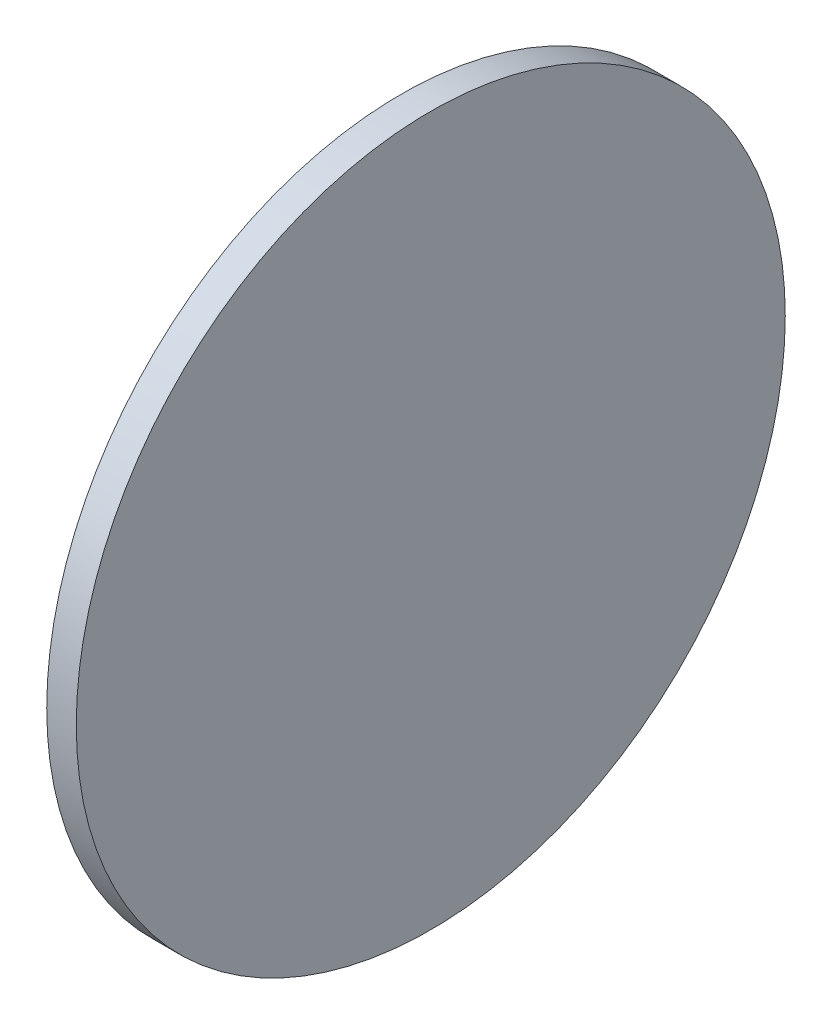
ISO-10303-21;
HEADER;
FILE_DESCRIPTION(('STEP AP214'),'2;1');
FILE_NAME('part.step','',(''),(''),'','','');
FILE_SCHEMA(('AUTOMOTIVE_DESIGN { 1 0 10303 214 1 1 1 1 }'));
ENDSEC;
DATA;
#1=APPLICATION_CONTEXT('core data for automotive mechanical design processes');
#2=APPLICATION_PROTOCOL_DEFINITION('international standard','automotive_design',2000,#1);
#3=PRODUCT_CONTEXT('',#1,'mechanical');
#4=PRODUCT('Part','Part','',(#3));
#5=PRODUCT_RELATED_PRODUCT_CATEGORY('part','',(#4));
#6=PRODUCT_DEFINITION_FORMATION('','',#4);
#7=PRODUCT_DEFINITION_CONTEXT('part definition',#1,'design');
#8=PRODUCT_DEFINITION('design','',#6,#7);
#9=PRODUCT_DEFINITION_SHAPE('','',#8);
#10=(LENGTH_UNIT() NAMED_UNIT(*) SI_UNIT(.MILLI.,.METRE.));
#11=(NAMED_UNIT(*) PLANE_ANGLE_UNIT() SI_UNIT($,.RADIAN.));
#12=(NAMED_UNIT(*) SI_UNIT($,.STERADIAN.) SOLID_ANGLE_UNIT());
#13=UNCERTAINTY_MEASURE_WITH_UNIT(LENGTH_MEASURE(1.E-05),#10,'distance_accuracy_value','');
#14=(GEOMETRIC_REPRESENTATION_CONTEXT(3) GLOBAL_UNCERTAINTY_ASSIGNED_CONTEXT((#13)) GLOBAL_UNIT_ASSIGNED_CONTEXT((#10,
#11,#12)) REPRESENTATION_CONTEXT('',''));
#15=CARTESIAN_POINT('',(0.,0.,0.));
#16=DIRECTION('',(0.,0.,1.));
#17=DIRECTION('',(1.,0.,0.));
#18=AXIS2_PLACEMENT_3D('',#15,#16,#17);
#19=CARTESIAN_POINT('',(1.,0.,0.));
#20=DIRECTION('',(-1.,0.,0.));
#21=DIRECTION('',(0.,0.,1.));
#22=AXIS2_PLACEMENT_3D('',#19,#20,#21);
#23=CYLINDRICAL_SURFACE('',#22,12.);
#24=CARTESIAN_POINT('',(1.,0.,0.));
#25=DIRECTION('',(1.,0.,0.));
#26=DIRECTION('',(0.,0.,-1.));
#27=AXIS2_PLACEMENT_3D('',#24,#25,#26);
#28=CIRCLE('',#27,12.);
#29=CARTESIAN_POINT('',(1.,0.,-12.));
#30=VERTEX_POINT('',#29);
#31=EDGE_CURVE('E10',#30,#30,#28,.T.);
#32=ORIENTED_EDGE('',*,*,#31,.F.);
#33=EDGE_LOOP('',(#32));
#34=FACE_BOUND('',#33,.T.);
#35=CARTESIAN_POINT('',(0.,0.,0.));
#36=DIRECTION('',(1.,0.,0.));
#37=DIRECTION('',(0.,0.,-1.));
#38=AXIS2_PLACEMENT_3D('',#35,#36,#37);
#39=CIRCLE('',#38,12.);
#40=CARTESIAN_POINT('',(0.,0.,-12.));
#41=VERTEX_POINT('',#40);
#42=EDGE_CURVE('E40',#41,#41,#39,.T.);
#43=ORIENTED_EDGE('',*,*,#42,.T.);
#44=EDGE_LOOP('',(#43));
#45=FACE_BOUND('',#44,.T.);
#46=ADVANCED_FACE('F37',(#34,#45),#23,.T.);
#47=CARTESIAN_POINT('',(1.,0.,0.));
#48=DIRECTION('',(1.,0.,0.));
#49=DIRECTION('',(0.,0.,-1.));
#50=AXIS2_PLACEMENT_3D('',#47,#48,#49);
#51=PLANE('',#50);
#52=ORIENTED_EDGE('',*,*,#31,.T.);
#53=EDGE_LOOP('',(#52));
#54=FACE_BOUND('',#53,.T.);
#55=ADVANCED_FACE('F54',(#54),#51,.T.);
#56=CARTESIAN_POINT('',(0.,0.,0.));
#57=DIRECTION('',(1.,0.,0.));
#58=DIRECTION('',(0.,0.,-1.));
#59=AXIS2_PLACEMENT_3D('',#56,#57,#58);
#60=PLANE('',#59);
#61=ORIENTED_EDGE('',*,*,#42,.F.);
#62=EDGE_LOOP('',(#61));
#63=FACE_BOUND('',#62,.T.);
#64=ADVANCED_FACE('F52',(#63),#60,.F.);
#65=CLOSED_SHELL('',(#46,#55,#64));
#66=MANIFOLD_SOLID_BREP('B2',#65);
#67=ADVANCED_BREP_SHAPE_REPRESENTATION('',(#18,#66),#14);
#68=SHAPE_DEFINITION_REPRESENTATION(#9,#67);
ENDSEC;
END-ISO-10303-21;
